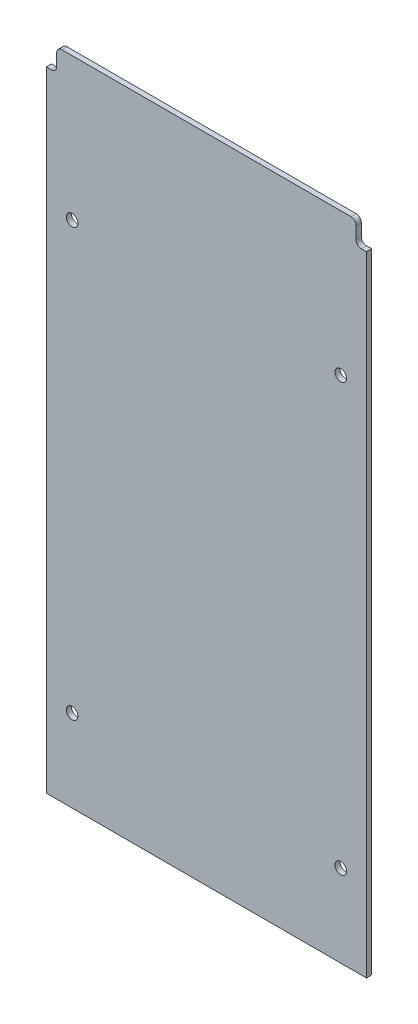
ISO-10303-21;
HEADER;
FILE_DESCRIPTION(('STEP AP214'),'2;1');
FILE_NAME('part.step','',(''),(''),'','','');
FILE_SCHEMA(('AUTOMOTIVE_DESIGN { 1 0 10303 214 1 1 1 1 }'));
ENDSEC;
DATA;
#1=APPLICATION_CONTEXT('core data for automotive mechanical design processes');
#2=APPLICATION_PROTOCOL_DEFINITION('international standard','automotive_design',2000,#1);
#3=PRODUCT_CONTEXT('',#1,'mechanical');
#4=PRODUCT('Part','Part','',(#3));
#5=PRODUCT_RELATED_PRODUCT_CATEGORY('part','',(#4));
#6=PRODUCT_DEFINITION_FORMATION('','',#4);
#7=PRODUCT_DEFINITION_CONTEXT('part definition',#1,'design');
#8=PRODUCT_DEFINITION('design','',#6,#7);
#9=PRODUCT_DEFINITION_SHAPE('','',#8);
#10=(LENGTH_UNIT() NAMED_UNIT(*) SI_UNIT(.MILLI.,.METRE.));
#11=(NAMED_UNIT(*) PLANE_ANGLE_UNIT() SI_UNIT($,.RADIAN.));
#12=(NAMED_UNIT(*) SI_UNIT($,.STERADIAN.) SOLID_ANGLE_UNIT());
#13=UNCERTAINTY_MEASURE_WITH_UNIT(LENGTH_MEASURE(1.E-05),#10,'distance_accuracy_value','');
#14=(GEOMETRIC_REPRESENTATION_CONTEXT(3) GLOBAL_UNCERTAINTY_ASSIGNED_CONTEXT((#13)) GLOBAL_UNIT_ASSIGNED_CONTEXT((#10,
#11,#12)) REPRESENTATION_CONTEXT('',''));
#15=CARTESIAN_POINT('',(0.,0.,0.));
#16=DIRECTION('',(0.,0.,1.));
#17=DIRECTION('',(1.,0.,0.));
#18=AXIS2_PLACEMENT_3D('',#15,#16,#17);
#19=CARTESIAN_POINT('',(281.197049999939,-361.949999999805,3.175));
#20=DIRECTION('',(-1.,0.,0.));
#21=DIRECTION('',(0.,0.,1.));
#22=AXIS2_PLACEMENT_3D('',#19,#20,#21);
#23=PLANE('',#22);
#24=DIRECTION('',(0.,1.,0.));
#25=VECTOR('',#24,1.);
#26=CARTESIAN_POINT('',(281.197049999939,-361.949999999805,0.));
#27=LINE('',#26,#25);
#28=CARTESIAN_POINT('',(281.197049999939,-361.949999999805,0.));
#29=VERTEX_POINT('',#28);
#30=CARTESIAN_POINT('',(281.197049999939,26.3524999954264,0.));
#31=VERTEX_POINT('',#30);
#32=EDGE_CURVE('E144',#29,#31,#27,.T.);
#33=ORIENTED_EDGE('',*,*,#32,.T.);
#34=DIRECTION('',(0.,0.,1.));
#35=VECTOR('',#34,1.);
#36=CARTESIAN_POINT('',(281.197049999939,26.3524999954264,0.));
#37=LINE('',#36,#35);
#38=CARTESIAN_POINT('',(281.197049999939,26.3524999954264,3.175));
#39=VERTEX_POINT('',#38);
#40=EDGE_CURVE('E213',#31,#39,#37,.T.);
#41=ORIENTED_EDGE('',*,*,#40,.T.);
#42=DIRECTION('',(0.,1.,0.));
#43=VECTOR('',#42,1.);
#44=CARTESIAN_POINT('',(281.197049999939,-361.949999999805,3.175));
#45=LINE('',#44,#43);
#46=CARTESIAN_POINT('',(281.197049999939,-361.949999999805,3.175));
#47=VERTEX_POINT('',#46);
#48=EDGE_CURVE('E153',#47,#39,#45,.T.);
#49=ORIENTED_EDGE('',*,*,#48,.F.);
#50=DIRECTION('',(0.,0.,-1.));
#51=VECTOR('',#50,1.);
#52=CARTESIAN_POINT('',(281.197049999939,-361.949999999805,3.175));
#53=LINE('',#52,#51);
#54=EDGE_CURVE('E159',#47,#29,#53,.T.);
#55=ORIENTED_EDGE('',*,*,#54,.T.);
#56=EDGE_LOOP('',(#33,#41,#49,#55));
#57=FACE_BOUND('',#56,.T.);
#58=ADVANCED_FACE('F37',(#57),#23,.F.);
#59=CARTESIAN_POINT('',(281.197049999939,40.3224999954264,3.175));
#60=DIRECTION('',(0.,-1.,0.));
#61=DIRECTION('',(1.,0.,0.));
#62=AXIS2_PLACEMENT_3D('',#59,#60,#61);
#63=PLANE('',#62);
#64=DIRECTION('',(-1.,0.,0.));
#65=VECTOR('',#64,1.);
#66=CARTESIAN_POINT('',(281.197049999939,40.3224999954264,0.));
#67=LINE('',#66,#65);
#68=CARTESIAN_POINT('',(271.672049999939,40.3224999954264,0.));
#69=VERTEX_POINT('',#68);
#70=CARTESIAN_POINT('',(93.1354500000002,40.3224999954264,0.));
#71=VERTEX_POINT('',#70);
#72=EDGE_CURVE('E151',#69,#71,#67,.T.);
#73=ORIENTED_EDGE('',*,*,#72,.T.);
#74=DIRECTION('',(0.,0.,1.));
#75=VECTOR('',#74,1.);
#76=CARTESIAN_POINT('',(93.1354500000002,40.3224999954264,3.175));
#77=LINE('',#76,#75);
#78=CARTESIAN_POINT('',(93.1354500000002,40.3224999954264,3.175));
#79=VERTEX_POINT('',#78);
#80=EDGE_CURVE('E173',#71,#79,#77,.T.);
#81=ORIENTED_EDGE('',*,*,#80,.T.);
#82=DIRECTION('',(-1.,0.,0.));
#83=VECTOR('',#82,1.);
#84=CARTESIAN_POINT('',(281.197049999939,40.3224999954264,3.175));
#85=LINE('',#84,#83);
#86=CARTESIAN_POINT('',(271.672049999939,40.3224999954264,3.175));
#87=VERTEX_POINT('',#86);
#88=EDGE_CURVE('E223',#87,#79,#85,.T.);
#89=ORIENTED_EDGE('',*,*,#88,.F.);
#90=DIRECTION('',(0.,0.,1.));
#91=VECTOR('',#90,1.);
#92=CARTESIAN_POINT('',(271.672049999939,40.3224999954264,3.175));
#93=LINE('',#92,#91);
#94=EDGE_CURVE('E171',#87,#69,#93,.F.);
#95=ORIENTED_EDGE('',*,*,#94,.T.);
#96=EDGE_LOOP('',(#73,#81,#89,#95));
#97=FACE_BOUND('',#96,.T.);
#98=ADVANCED_FACE('F290',(#97),#63,.F.);
#99=CARTESIAN_POINT('',(83.6104500000002,-361.949999999805,3.175));
#100=DIRECTION('',(1.,0.,0.));
#101=DIRECTION('',(0.,0.,-1.));
#102=AXIS2_PLACEMENT_3D('',#99,#100,#101);
#103=PLANE('',#102);
#104=DIRECTION('',(0.,-1.,0.));
#105=VECTOR('',#104,1.);
#106=CARTESIAN_POINT('',(83.6104500000002,-361.949999999805,3.175));
#107=LINE('',#106,#105);
#108=CARTESIAN_POINT('',(83.6104500000002,26.3524999954264,3.175));
#109=VERTEX_POINT('',#108);
#110=CARTESIAN_POINT('',(83.6104500000002,-361.949999999805,3.175));
#111=VERTEX_POINT('',#110);
#112=EDGE_CURVE('E143',#109,#111,#107,.T.);
#113=ORIENTED_EDGE('',*,*,#112,.F.);
#114=DIRECTION('',(0.,0.,1.));
#115=VECTOR('',#114,1.);
#116=CARTESIAN_POINT('',(83.6104500000002,26.3524999954264,0.));
#117=LINE('',#116,#115);
#118=CARTESIAN_POINT('',(83.6104500000002,26.3524999954264,0.));
#119=VERTEX_POINT('',#118);
#120=EDGE_CURVE('E129',#119,#109,#117,.T.);
#121=ORIENTED_EDGE('',*,*,#120,.F.);
#122=DIRECTION('',(0.,-1.,0.));
#123=VECTOR('',#122,1.);
#124=CARTESIAN_POINT('',(83.6104500000002,-361.949999999805,0.));
#125=LINE('',#124,#123);
#126=CARTESIAN_POINT('',(83.6104500000002,-361.949999999805,0.));
#127=VERTEX_POINT('',#126);
#128=EDGE_CURVE('E141',#119,#127,#125,.T.);
#129=ORIENTED_EDGE('',*,*,#128,.T.);
#130=DIRECTION('',(0.,0.,-1.));
#131=VECTOR('',#130,1.);
#132=CARTESIAN_POINT('',(83.6104500000002,-361.949999999805,3.175));
#133=LINE('',#132,#131);
#134=EDGE_CURVE('E162',#111,#127,#133,.T.);
#135=ORIENTED_EDGE('',*,*,#134,.F.);
#136=EDGE_LOOP('',(#113,#121,#129,#135));
#137=FACE_BOUND('',#136,.T.);
#138=ADVANCED_FACE('F139',(#137),#103,.F.);
#139=CARTESIAN_POINT('',(281.197049999939,-361.949999999805,3.175));
#140=DIRECTION('',(0.,1.,0.));
#141=DIRECTION('',(0.,0.,1.));
#142=AXIS2_PLACEMENT_3D('',#139,#140,#141);
#143=PLANE('',#142);
#144=DIRECTION('',(1.,0.,0.));
#145=VECTOR('',#144,1.);
#146=CARTESIAN_POINT('',(281.197049999939,-361.949999999805,0.));
#147=LINE('',#146,#145);
#148=EDGE_CURVE('E150',#127,#29,#147,.T.);
#149=ORIENTED_EDGE('',*,*,#148,.T.);
#150=ORIENTED_EDGE('',*,*,#54,.F.);
#151=DIRECTION('',(1.,0.,0.));
#152=VECTOR('',#151,1.);
#153=CARTESIAN_POINT('',(281.197049999939,-361.949999999805,3.175));
#154=LINE('',#153,#152);
#155=EDGE_CURVE('E163',#111,#47,#154,.T.);
#156=ORIENTED_EDGE('',*,*,#155,.F.);
#157=ORIENTED_EDGE('',*,*,#134,.T.);
#158=EDGE_LOOP('',(#149,#150,#156,#157));
#159=FACE_BOUND('',#158,.T.);
#160=ADVANCED_FACE('F231',(#159),#143,.F.);
#161=CARTESIAN_POINT('',(0.,0.,3.175));
#162=DIRECTION('',(0.,0.,1.));
#163=DIRECTION('',(1.,0.,0.));
#164=AXIS2_PLACEMENT_3D('',#161,#162,#163);
#165=PLANE('',#164);
#166=CARTESIAN_POINT('',(99.4854003074481,-47.6219439182577,3.175));
#167=DIRECTION('',(0.,0.,1.));
#168=DIRECTION('',(1.,0.,0.));
#169=AXIS2_PLACEMENT_3D('',#166,#167,#168);
#170=CIRCLE('',#169,3.57123999999999);
#171=CARTESIAN_POINT('',(103.056640307448,-47.6219439182577,3.175));
#172=VERTEX_POINT('',#171);
#173=EDGE_CURVE('E259',#172,#172,#170,.T.);
#174=ORIENTED_EDGE('',*,*,#173,.F.);
#175=EDGE_LOOP('',(#174));
#176=FACE_BOUND('',#175,.T.);
#177=CARTESIAN_POINT('',(265.322049999961,-47.6250000000233,3.175));
#178=DIRECTION('',(0.,0.,1.));
#179=DIRECTION('',(1.,0.,0.));
#180=AXIS2_PLACEMENT_3D('',#177,#178,#179);
#181=CIRCLE('',#180,3.57123999999998);
#182=CARTESIAN_POINT('',(268.893289999961,-47.6250000000233,3.175));
#183=VERTEX_POINT('',#182);
#184=EDGE_CURVE('E253',#183,#183,#181,.T.);
#185=ORIENTED_EDGE('',*,*,#184,.F.);
#186=EDGE_LOOP('',(#185));
#187=FACE_BOUND('',#186,.T.);
#188=CARTESIAN_POINT('',(265.322050000049,-311.150000000025,3.175));
#189=DIRECTION('',(0.,0.,1.));
#190=DIRECTION('',(1.,0.,0.));
#191=AXIS2_PLACEMENT_3D('',#188,#189,#190);
#192=CIRCLE('',#191,3.57123999999998);
#193=CARTESIAN_POINT('',(268.893290000049,-311.150000000025,3.175));
#194=VERTEX_POINT('',#193);
#195=EDGE_CURVE('E247',#194,#194,#192,.T.);
#196=ORIENTED_EDGE('',*,*,#195,.F.);
#197=EDGE_LOOP('',(#196));
#198=FACE_BOUND('',#197,.T.);
#199=CARTESIAN_POINT('',(99.4854996924384,-311.146943918291,3.175));
#200=DIRECTION('',(0.,0.,1.));
#201=DIRECTION('',(1.,0.,0.));
#202=AXIS2_PLACEMENT_3D('',#199,#200,#201);
#203=CIRCLE('',#202,3.57123999999999);
#204=CARTESIAN_POINT('',(103.056739692438,-311.146943918291,3.175));
#205=VERTEX_POINT('',#204);
#206=EDGE_CURVE('E241',#205,#205,#203,.T.);
#207=ORIENTED_EDGE('',*,*,#206,.F.);
#208=EDGE_LOOP('',(#207));
#209=FACE_BOUND('',#208,.T.);
#210=ORIENTED_EDGE('',*,*,#88,.T.);
#211=CARTESIAN_POINT('',(93.1354500000002,37.1474999954264,3.175));
#212=DIRECTION('',(0.,0.,1.));
#213=DIRECTION('',(1.,0.,0.));
#214=AXIS2_PLACEMENT_3D('',#211,#212,#213);
#215=CIRCLE('',#214,3.175);
#216=CARTESIAN_POINT('',(89.9604500000002,37.1474999954264,3.175));
#217=VERTEX_POINT('',#216);
#218=EDGE_CURVE('E178',#79,#217,#215,.T.);
#219=ORIENTED_EDGE('',*,*,#218,.T.);
#220=DIRECTION('',(0.,1.,0.));
#221=VECTOR('',#220,1.);
#222=CARTESIAN_POINT('',(89.9604500000002,40.3224999954264,3.175));
#223=LINE('',#222,#221);
#224=CARTESIAN_POINT('',(89.9604500000002,29.5274999954264,3.175));
#225=VERTEX_POINT('',#224);
#226=EDGE_CURVE('E217',#225,#217,#223,.T.);
#227=ORIENTED_EDGE('',*,*,#226,.F.);
#228=CARTESIAN_POINT('',(86.7854500000002,29.5274999954264,3.175));
#229=DIRECTION('',(0.,0.,1.));
#230=DIRECTION('',(1.,0.,0.));
#231=AXIS2_PLACEMENT_3D('',#228,#229,#230);
#232=CIRCLE('',#231,3.175);
#233=CARTESIAN_POINT('',(86.7854500000002,26.3524999954264,3.175));
#234=VERTEX_POINT('',#233);
#235=EDGE_CURVE('E191',#225,#234,#232,.F.);
#236=ORIENTED_EDGE('',*,*,#235,.T.);
#237=DIRECTION('',(1.,0.,0.));
#238=VECTOR('',#237,1.);
#239=CARTESIAN_POINT('',(89.9604500000002,26.3524999954264,3.175));
#240=LINE('',#239,#238);
#241=EDGE_CURVE('E232',#109,#234,#240,.T.);
#242=ORIENTED_EDGE('',*,*,#241,.F.);
#243=ORIENTED_EDGE('',*,*,#112,.T.);
#244=ORIENTED_EDGE('',*,*,#155,.T.);
#245=ORIENTED_EDGE('',*,*,#48,.T.);
#246=DIRECTION('',(1.,0.,0.));
#247=VECTOR('',#246,1.);
#248=CARTESIAN_POINT('',(274.847049999939,26.3524999954264,3.175));
#249=LINE('',#248,#247);
#250=CARTESIAN_POINT('',(278.022049999939,26.3524999954264,3.175));
#251=VERTEX_POINT('',#250);
#252=EDGE_CURVE('E201',#251,#39,#249,.T.);
#253=ORIENTED_EDGE('',*,*,#252,.F.);
#254=CARTESIAN_POINT('',(278.022049999939,29.5274999954264,3.175));
#255=DIRECTION('',(0.,0.,1.));
#256=DIRECTION('',(1.,0.,0.));
#257=AXIS2_PLACEMENT_3D('',#254,#255,#256);
#258=CIRCLE('',#257,3.175);
#259=CARTESIAN_POINT('',(274.847049999939,29.5274999954264,3.175));
#260=VERTEX_POINT('',#259);
#261=EDGE_CURVE('E45',#251,#260,#258,.F.);
#262=ORIENTED_EDGE('',*,*,#261,.T.);
#263=DIRECTION('',(0.,-1.,0.));
#264=VECTOR('',#263,1.);
#265=CARTESIAN_POINT('',(274.847049999939,40.3224999954264,3.175));
#266=LINE('',#265,#264);
#267=CARTESIAN_POINT('',(274.847049999939,37.1474999954264,3.175));
#268=VERTEX_POINT('',#267);
#269=EDGE_CURVE('E199',#268,#260,#266,.T.);
#270=ORIENTED_EDGE('',*,*,#269,.F.);
#271=CARTESIAN_POINT('',(271.672049999939,37.1474999954264,3.175));
#272=DIRECTION('',(0.,0.,1.));
#273=DIRECTION('',(1.,0.,0.));
#274=AXIS2_PLACEMENT_3D('',#271,#272,#273);
#275=CIRCLE('',#274,3.175);
#276=EDGE_CURVE('E176',#268,#87,#275,.T.);
#277=ORIENTED_EDGE('',*,*,#276,.T.);
#278=EDGE_LOOP('',(#210,#219,#227,#236,#242,#243,#244,#245,#253,#262,#270,#277));
#279=FACE_BOUND('',#278,.T.);
#280=ADVANCED_FACE('F198',(#176,#187,#198,#209,#279),#165,.T.);
#281=CARTESIAN_POINT('',(0.,0.,0.));
#282=DIRECTION('',(0.,0.,1.));
#283=DIRECTION('',(1.,0.,0.));
#284=AXIS2_PLACEMENT_3D('',#281,#282,#283);
#285=PLANE('',#284);
#286=CARTESIAN_POINT('',(99.4854003074481,-47.6219439182577,0.));
#287=DIRECTION('',(0.,0.,1.));
#288=DIRECTION('',(1.,0.,0.));
#289=AXIS2_PLACEMENT_3D('',#286,#287,#288);
#290=CIRCLE('',#289,3.57124);
#291=CARTESIAN_POINT('',(103.056640307448,-47.6219439182577,0.));
#292=VERTEX_POINT('',#291);
#293=EDGE_CURVE('E256',#292,#292,#290,.T.);
#294=ORIENTED_EDGE('',*,*,#293,.T.);
#295=EDGE_LOOP('',(#294));
#296=FACE_BOUND('',#295,.T.);
#297=CARTESIAN_POINT('',(265.322049999961,-47.6250000000233,0.));
#298=DIRECTION('',(0.,0.,1.));
#299=DIRECTION('',(1.,0.,0.));
#300=AXIS2_PLACEMENT_3D('',#297,#298,#299);
#301=CIRCLE('',#300,3.57123999999998);
#302=CARTESIAN_POINT('',(268.893289999961,-47.6250000000233,0.));
#303=VERTEX_POINT('',#302);
#304=EDGE_CURVE('E250',#303,#303,#301,.T.);
#305=ORIENTED_EDGE('',*,*,#304,.T.);
#306=EDGE_LOOP('',(#305));
#307=FACE_BOUND('',#306,.T.);
#308=CARTESIAN_POINT('',(265.322050000049,-311.150000000025,0.));
#309=DIRECTION('',(0.,0.,1.));
#310=DIRECTION('',(1.,0.,0.));
#311=AXIS2_PLACEMENT_3D('',#308,#309,#310);
#312=CIRCLE('',#311,3.57123999999998);
#313=CARTESIAN_POINT('',(268.893290000049,-311.150000000025,0.));
#314=VERTEX_POINT('',#313);
#315=EDGE_CURVE('E244',#314,#314,#312,.T.);
#316=ORIENTED_EDGE('',*,*,#315,.T.);
#317=EDGE_LOOP('',(#316));
#318=FACE_BOUND('',#317,.T.);
#319=CARTESIAN_POINT('',(99.4854996924384,-311.146943918291,0.));
#320=DIRECTION('',(0.,0.,1.));
#321=DIRECTION('',(1.,0.,0.));
#322=AXIS2_PLACEMENT_3D('',#319,#320,#321);
#323=CIRCLE('',#322,3.57124);
#324=CARTESIAN_POINT('',(103.056739692438,-311.146943918291,0.));
#325=VERTEX_POINT('',#324);
#326=EDGE_CURVE('E206',#325,#325,#323,.T.);
#327=ORIENTED_EDGE('',*,*,#326,.T.);
#328=EDGE_LOOP('',(#327));
#329=FACE_BOUND('',#328,.T.);
#330=DIRECTION('',(0.,1.,0.));
#331=VECTOR('',#330,1.);
#332=CARTESIAN_POINT('',(89.9604500000002,40.3224999954264,0.));
#333=LINE('',#332,#331);
#334=CARTESIAN_POINT('',(89.9604500000002,29.5274999954264,0.));
#335=VERTEX_POINT('',#334);
#336=CARTESIAN_POINT('',(89.9604500000002,37.1474999954264,0.));
#337=VERTEX_POINT('',#336);
#338=EDGE_CURVE('E135',#335,#337,#333,.T.);
#339=ORIENTED_EDGE('',*,*,#338,.T.);
#340=CARTESIAN_POINT('',(93.1354500000002,37.1474999954264,0.));
#341=DIRECTION('',(0.,0.,1.));
#342=DIRECTION('',(1.,0.,0.));
#343=AXIS2_PLACEMENT_3D('',#340,#341,#342);
#344=CIRCLE('',#343,3.175);
#345=EDGE_CURVE('E182',#337,#71,#344,.F.);
#346=ORIENTED_EDGE('',*,*,#345,.T.);
#347=ORIENTED_EDGE('',*,*,#72,.F.);
#348=CARTESIAN_POINT('',(271.672049999939,37.1474999954264,0.));
#349=DIRECTION('',(0.,0.,1.));
#350=DIRECTION('',(1.,0.,0.));
#351=AXIS2_PLACEMENT_3D('',#348,#349,#350);
#352=CIRCLE('',#351,3.175);
#353=CARTESIAN_POINT('',(274.847049999939,37.1474999954264,0.));
#354=VERTEX_POINT('',#353);
#355=EDGE_CURVE('E180',#69,#354,#352,.F.);
#356=ORIENTED_EDGE('',*,*,#355,.T.);
#357=DIRECTION('',(0.,-1.,0.));
#358=VECTOR('',#357,1.);
#359=CARTESIAN_POINT('',(274.847049999939,40.3224999954264,0.));
#360=LINE('',#359,#358);
#361=CARTESIAN_POINT('',(274.847049999939,29.5274999954264,0.));
#362=VERTEX_POINT('',#361);
#363=EDGE_CURVE('E215',#354,#362,#360,.T.);
#364=ORIENTED_EDGE('',*,*,#363,.T.);
#365=CARTESIAN_POINT('',(278.022049999939,29.5274999954264,0.));
#366=DIRECTION('',(0.,0.,1.));
#367=DIRECTION('',(1.,0.,0.));
#368=AXIS2_PLACEMENT_3D('',#365,#366,#367);
#369=CIRCLE('',#368,3.175);
#370=CARTESIAN_POINT('',(278.022049999939,26.3524999954264,0.));
#371=VERTEX_POINT('',#370);
#372=EDGE_CURVE('E11',#362,#371,#369,.T.);
#373=ORIENTED_EDGE('',*,*,#372,.T.);
#374=DIRECTION('',(1.,0.,0.));
#375=VECTOR('',#374,1.);
#376=CARTESIAN_POINT('',(274.847049999939,26.3524999954264,0.));
#377=LINE('',#376,#375);
#378=EDGE_CURVE('E212',#371,#31,#377,.T.);
#379=ORIENTED_EDGE('',*,*,#378,.T.);
#380=ORIENTED_EDGE('',*,*,#32,.F.);
#381=ORIENTED_EDGE('',*,*,#148,.F.);
#382=ORIENTED_EDGE('',*,*,#128,.F.);
#383=DIRECTION('',(1.,0.,0.));
#384=VECTOR('',#383,1.);
#385=CARTESIAN_POINT('',(89.9604500000002,26.3524999954264,0.));
#386=LINE('',#385,#384);
#387=CARTESIAN_POINT('',(86.7854500000002,26.3524999954264,0.));
#388=VERTEX_POINT('',#387);
#389=EDGE_CURVE('E125',#119,#388,#386,.T.);
#390=ORIENTED_EDGE('',*,*,#389,.T.);
#391=CARTESIAN_POINT('',(86.7854500000002,29.5274999954264,0.));
#392=DIRECTION('',(0.,0.,1.));
#393=DIRECTION('',(1.,0.,0.));
#394=AXIS2_PLACEMENT_3D('',#391,#392,#393);
#395=CIRCLE('',#394,3.175);
#396=EDGE_CURVE('E193',#388,#335,#395,.T.);
#397=ORIENTED_EDGE('',*,*,#396,.T.);
#398=EDGE_LOOP('',(#339,#346,#347,#356,#364,#373,#379,#380,#381,#382,#390,#397));
#399=FACE_BOUND('',#398,.T.);
#400=ADVANCED_FACE('F148',(#296,#307,#318,#329,#399),#285,.F.);
#401=CARTESIAN_POINT('',(274.847049999939,40.3224999954264,0.));
#402=DIRECTION('',(-1.,0.,0.));
#403=DIRECTION('',(0.,0.,1.));
#404=AXIS2_PLACEMENT_3D('',#401,#402,#403);
#405=PLANE('',#404);
#406=ORIENTED_EDGE('',*,*,#363,.F.);
#407=DIRECTION('',(0.,0.,1.));
#408=VECTOR('',#407,1.);
#409=CARTESIAN_POINT('',(274.847049999939,37.1474999954264,0.));
#410=LINE('',#409,#408);
#411=EDGE_CURVE('E185',#354,#268,#410,.T.);
#412=ORIENTED_EDGE('',*,*,#411,.T.);
#413=ORIENTED_EDGE('',*,*,#269,.T.);
#414=DIRECTION('',(0.,0.,1.));
#415=VECTOR('',#414,1.);
#416=CARTESIAN_POINT('',(274.847049999939,29.5274999954264,0.));
#417=LINE('',#416,#415);
#418=EDGE_CURVE('E58',#260,#362,#417,.F.);
#419=ORIENTED_EDGE('',*,*,#418,.T.);
#420=EDGE_LOOP('',(#406,#412,#413,#419));
#421=FACE_BOUND('',#420,.T.);
#422=ADVANCED_FACE('F204',(#421),#405,.F.);
#423=CARTESIAN_POINT('',(274.847049999939,26.3524999954264,0.));
#424=DIRECTION('',(0.,-1.,0.));
#425=DIRECTION('',(0.,0.,-1.));
#426=AXIS2_PLACEMENT_3D('',#423,#424,#425);
#427=PLANE('',#426);
#428=ORIENTED_EDGE('',*,*,#378,.F.);
#429=DIRECTION('',(0.,0.,1.));
#430=VECTOR('',#429,1.);
#431=CARTESIAN_POINT('',(278.022049999939,26.3524999954264,3.175));
#432=LINE('',#431,#430);
#433=EDGE_CURVE('E188',#371,#251,#432,.T.);
#434=ORIENTED_EDGE('',*,*,#433,.T.);
#435=ORIENTED_EDGE('',*,*,#252,.T.);
#436=ORIENTED_EDGE('',*,*,#40,.F.);
#437=EDGE_LOOP('',(#428,#434,#435,#436));
#438=FACE_BOUND('',#437,.T.);
#439=ADVANCED_FACE('F209',(#438),#427,.F.);
#440=CARTESIAN_POINT('',(89.9604500000002,40.3224999954264,0.));
#441=DIRECTION('',(1.,0.,0.));
#442=DIRECTION('',(0.,0.,-1.));
#443=AXIS2_PLACEMENT_3D('',#440,#441,#442);
#444=PLANE('',#443);
#445=ORIENTED_EDGE('',*,*,#338,.F.);
#446=DIRECTION('',(0.,0.,1.));
#447=VECTOR('',#446,1.);
#448=CARTESIAN_POINT('',(89.9604500000002,29.5274999954264,3.175));
#449=LINE('',#448,#447);
#450=EDGE_CURVE('E167',#335,#225,#449,.T.);
#451=ORIENTED_EDGE('',*,*,#450,.T.);
#452=ORIENTED_EDGE('',*,*,#226,.T.);
#453=DIRECTION('',(0.,0.,1.));
#454=VECTOR('',#453,1.);
#455=CARTESIAN_POINT('',(89.9604500000002,37.1474999954264,0.));
#456=LINE('',#455,#454);
#457=EDGE_CURVE('E165',#217,#337,#456,.F.);
#458=ORIENTED_EDGE('',*,*,#457,.T.);
#459=EDGE_LOOP('',(#445,#451,#452,#458));
#460=FACE_BOUND('',#459,.T.);
#461=ADVANCED_FACE('F319',(#460),#444,.F.);
#462=CARTESIAN_POINT('',(89.9604500000002,26.3524999954264,0.));
#463=DIRECTION('',(0.,-1.,0.));
#464=DIRECTION('',(0.,0.,-1.));
#465=AXIS2_PLACEMENT_3D('',#462,#463,#464);
#466=PLANE('',#465);
#467=ORIENTED_EDGE('',*,*,#241,.T.);
#468=DIRECTION('',(0.,0.,1.));
#469=VECTOR('',#468,1.);
#470=CARTESIAN_POINT('',(86.7854500000002,26.3524999954264,0.));
#471=LINE('',#470,#469);
#472=EDGE_CURVE('E132',#234,#388,#471,.F.);
#473=ORIENTED_EDGE('',*,*,#472,.T.);
#474=ORIENTED_EDGE('',*,*,#389,.F.);
#475=ORIENTED_EDGE('',*,*,#120,.T.);
#476=EDGE_LOOP('',(#467,#473,#474,#475));
#477=FACE_BOUND('',#476,.T.);
#478=ADVANCED_FACE('F128',(#477),#466,.F.);
#479=CARTESIAN_POINT('',(86.7854500000002,29.5274999954264,0.));
#480=DIRECTION('',(0.,0.,-1.));
#481=DIRECTION('',(-1.,0.,0.));
#482=AXIS2_PLACEMENT_3D('',#479,#480,#481);
#483=CYLINDRICAL_SURFACE('',#482,3.175);
#484=ORIENTED_EDGE('',*,*,#396,.F.);
#485=ORIENTED_EDGE('',*,*,#472,.F.);
#486=ORIENTED_EDGE('',*,*,#235,.F.);
#487=ORIENTED_EDGE('',*,*,#450,.F.);
#488=EDGE_LOOP('',(#484,#485,#486,#487));
#489=FACE_BOUND('',#488,.T.);
#490=ADVANCED_FACE('F299',(#489),#483,.F.);
#491=CARTESIAN_POINT('',(93.1354500000002,37.1474999954264,3.175));
#492=DIRECTION('',(0.,0.,1.));
#493=DIRECTION('',(1.,0.,0.));
#494=AXIS2_PLACEMENT_3D('',#491,#492,#493);
#495=CYLINDRICAL_SURFACE('',#494,3.175);
#496=ORIENTED_EDGE('',*,*,#345,.F.);
#497=ORIENTED_EDGE('',*,*,#457,.F.);
#498=ORIENTED_EDGE('',*,*,#218,.F.);
#499=ORIENTED_EDGE('',*,*,#80,.F.);
#500=EDGE_LOOP('',(#496,#497,#498,#499));
#501=FACE_BOUND('',#500,.T.);
#502=ADVANCED_FACE('F302',(#501),#495,.T.);
#503=CARTESIAN_POINT('',(271.672049999939,37.1474999954264,0.));
#504=DIRECTION('',(0.,0.,1.));
#505=DIRECTION('',(1.,0.,0.));
#506=AXIS2_PLACEMENT_3D('',#503,#504,#505);
#507=CYLINDRICAL_SURFACE('',#506,3.175);
#508=ORIENTED_EDGE('',*,*,#355,.F.);
#509=ORIENTED_EDGE('',*,*,#94,.F.);
#510=ORIENTED_EDGE('',*,*,#276,.F.);
#511=ORIENTED_EDGE('',*,*,#411,.F.);
#512=EDGE_LOOP('',(#508,#509,#510,#511));
#513=FACE_BOUND('',#512,.T.);
#514=ADVANCED_FACE('F286',(#513),#507,.T.);
#515=CARTESIAN_POINT('',(278.022049999939,29.5274999954264,0.));
#516=DIRECTION('',(0.,0.,-1.));
#517=DIRECTION('',(-1.,0.,0.));
#518=AXIS2_PLACEMENT_3D('',#515,#516,#517);
#519=CYLINDRICAL_SURFACE('',#518,3.175);
#520=ORIENTED_EDGE('',*,*,#372,.F.);
#521=ORIENTED_EDGE('',*,*,#418,.F.);
#522=ORIENTED_EDGE('',*,*,#261,.F.);
#523=ORIENTED_EDGE('',*,*,#433,.F.);
#524=EDGE_LOOP('',(#520,#521,#522,#523));
#525=FACE_BOUND('',#524,.T.);
#526=ADVANCED_FACE('F39',(#525),#519,.F.);
#527=CARTESIAN_POINT('',(99.4854996924384,-311.146943918291,3.175));
#528=DIRECTION('',(0.,0.,1.));
#529=DIRECTION('',(1.,0.,0.));
#530=AXIS2_PLACEMENT_3D('',#527,#528,#529);
#531=CYLINDRICAL_SURFACE('',#530,3.57124);
#532=ORIENTED_EDGE('',*,*,#326,.F.);
#533=EDGE_LOOP('',(#532));
#534=FACE_BOUND('',#533,.T.);
#535=ORIENTED_EDGE('',*,*,#206,.T.);
#536=EDGE_LOOP('',(#535));
#537=FACE_BOUND('',#536,.T.);
#538=ADVANCED_FACE('F274',(#534,#537),#531,.F.);
#539=CARTESIAN_POINT('',(265.322050000049,-311.150000000025,3.175));
#540=DIRECTION('',(0.,0.,1.));
#541=DIRECTION('',(1.,0.,0.));
#542=AXIS2_PLACEMENT_3D('',#539,#540,#541);
#543=CYLINDRICAL_SURFACE('',#542,3.57123999999998);
#544=ORIENTED_EDGE('',*,*,#315,.F.);
#545=EDGE_LOOP('',(#544));
#546=FACE_BOUND('',#545,.T.);
#547=ORIENTED_EDGE('',*,*,#195,.T.);
#548=EDGE_LOOP('',(#547));
#549=FACE_BOUND('',#548,.T.);
#550=ADVANCED_FACE('F276',(#546,#549),#543,.F.);
#551=CARTESIAN_POINT('',(265.322049999961,-47.6250000000233,3.175));
#552=DIRECTION('',(0.,0.,1.));
#553=DIRECTION('',(1.,0.,0.));
#554=AXIS2_PLACEMENT_3D('',#551,#552,#553);
#555=CYLINDRICAL_SURFACE('',#554,3.57123999999998);
#556=ORIENTED_EDGE('',*,*,#304,.F.);
#557=EDGE_LOOP('',(#556));
#558=FACE_BOUND('',#557,.T.);
#559=ORIENTED_EDGE('',*,*,#184,.T.);
#560=EDGE_LOOP('',(#559));
#561=FACE_BOUND('',#560,.T.);
#562=ADVANCED_FACE('F283',(#558,#561),#555,.F.);
#563=CARTESIAN_POINT('',(99.4854003074481,-47.6219439182577,3.175));
#564=DIRECTION('',(0.,0.,1.));
#565=DIRECTION('',(1.,0.,0.));
#566=AXIS2_PLACEMENT_3D('',#563,#564,#565);
#567=CYLINDRICAL_SURFACE('',#566,3.57124);
#568=ORIENTED_EDGE('',*,*,#293,.F.);
#569=EDGE_LOOP('',(#568));
#570=FACE_BOUND('',#569,.T.);
#571=ORIENTED_EDGE('',*,*,#173,.T.);
#572=EDGE_LOOP('',(#571));
#573=FACE_BOUND('',#572,.T.);
#574=ADVANCED_FACE('F263',(#570,#573),#567,.F.);
#575=CLOSED_SHELL('',(#58,#98,#138,#160,#280,#400,#422,#439,#461,#478,#490,#502,#514,#526,#538,
#550,#562,#574));
#576=MANIFOLD_SOLID_BREP('B2',#575);
#577=ADVANCED_BREP_SHAPE_REPRESENTATION('',(#18,#576),#14);
#578=SHAPE_DEFINITION_REPRESENTATION(#9,#577);
ENDSEC;
END-ISO-10303-21;
